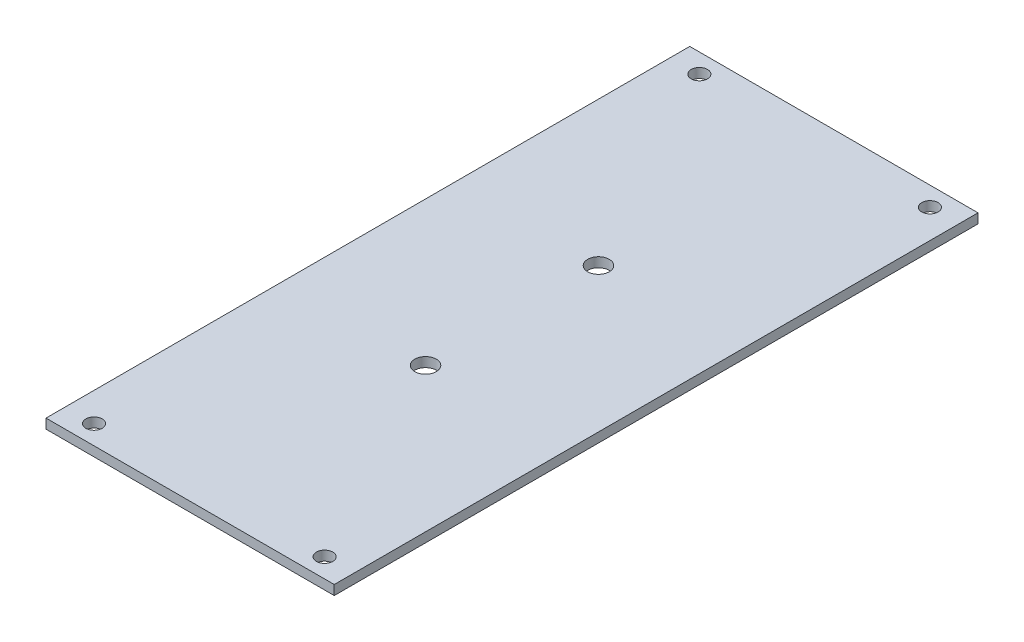
ISO-10303-21;
HEADER;
FILE_DESCRIPTION(('STEP AP214'),'2;1');
FILE_NAME('part.step','',(''),(''),'','','');
FILE_SCHEMA(('AUTOMOTIVE_DESIGN { 1 0 10303 214 1 1 1 1 }'));
ENDSEC;
DATA;
#1=APPLICATION_CONTEXT('core data for automotive mechanical design processes');
#2=APPLICATION_PROTOCOL_DEFINITION('international standard','automotive_design',2000,#1);
#3=PRODUCT_CONTEXT('',#1,'mechanical');
#4=PRODUCT('Part','Part','',(#3));
#5=PRODUCT_RELATED_PRODUCT_CATEGORY('part','',(#4));
#6=PRODUCT_DEFINITION_FORMATION('','',#4);
#7=PRODUCT_DEFINITION_CONTEXT('part definition',#1,'design');
#8=PRODUCT_DEFINITION('design','',#6,#7);
#9=PRODUCT_DEFINITION_SHAPE('','',#8);
#10=(LENGTH_UNIT() NAMED_UNIT(*) SI_UNIT(.MILLI.,.METRE.));
#11=(NAMED_UNIT(*) PLANE_ANGLE_UNIT() SI_UNIT($,.RADIAN.));
#12=(NAMED_UNIT(*) SI_UNIT($,.STERADIAN.) SOLID_ANGLE_UNIT());
#13=UNCERTAINTY_MEASURE_WITH_UNIT(LENGTH_MEASURE(1.E-05),#10,'distance_accuracy_value','');
#14=(GEOMETRIC_REPRESENTATION_CONTEXT(3) GLOBAL_UNCERTAINTY_ASSIGNED_CONTEXT((#13)) GLOBAL_UNIT_ASSIGNED_CONTEXT((#10,
#11,#12)) REPRESENTATION_CONTEXT('',''));
#15=CARTESIAN_POINT('',(0.,0.,0.));
#16=DIRECTION('',(0.,0.,1.));
#17=DIRECTION('',(1.,0.,0.));
#18=AXIS2_PLACEMENT_3D('',#15,#16,#17);
#19=CARTESIAN_POINT('',(30.,2.,-67.));
#20=DIRECTION('',(-1.,0.,0.));
#21=DIRECTION('',(0.,0.,1.));
#22=AXIS2_PLACEMENT_3D('',#19,#20,#21);
#23=PLANE('',#22);
#24=DIRECTION('',(0.,0.,-1.));
#25=VECTOR('',#24,1.);
#26=CARTESIAN_POINT('',(30.,0.,-67.));
#27=LINE('',#26,#25);
#28=CARTESIAN_POINT('',(30.,0.,67.));
#29=VERTEX_POINT('',#28);
#30=CARTESIAN_POINT('',(30.,0.,-67.));
#31=VERTEX_POINT('',#30);
#32=EDGE_CURVE('E103',#29,#31,#27,.T.);
#33=ORIENTED_EDGE('',*,*,#32,.T.);
#34=DIRECTION('',(0.,-1.,0.));
#35=VECTOR('',#34,1.);
#36=CARTESIAN_POINT('',(30.,2.,-67.));
#37=LINE('',#36,#35);
#38=CARTESIAN_POINT('',(30.,2.,-67.));
#39=VERTEX_POINT('',#38);
#40=EDGE_CURVE('E11',#39,#31,#37,.T.);
#41=ORIENTED_EDGE('',*,*,#40,.F.);
#42=DIRECTION('',(0.,0.,-1.));
#43=VECTOR('',#42,1.);
#44=CARTESIAN_POINT('',(30.,2.,-67.));
#45=LINE('',#44,#43);
#46=CARTESIAN_POINT('',(30.,2.,67.));
#47=VERTEX_POINT('',#46);
#48=EDGE_CURVE('E90',#47,#39,#45,.T.);
#49=ORIENTED_EDGE('',*,*,#48,.F.);
#50=DIRECTION('',(0.,-1.,0.));
#51=VECTOR('',#50,1.);
#52=CARTESIAN_POINT('',(30.,2.,67.));
#53=LINE('',#52,#51);
#54=EDGE_CURVE('E99',#47,#29,#53,.T.);
#55=ORIENTED_EDGE('',*,*,#54,.T.);
#56=EDGE_LOOP('',(#33,#41,#49,#55));
#57=FACE_BOUND('',#56,.T.);
#58=ADVANCED_FACE('F37',(#57),#23,.F.);
#59=CARTESIAN_POINT('',(-30.,2.,-67.));
#60=DIRECTION('',(0.,0.,1.));
#61=DIRECTION('',(1.,0.,0.));
#62=AXIS2_PLACEMENT_3D('',#59,#60,#61);
#63=PLANE('',#62);
#64=DIRECTION('',(-1.,0.,0.));
#65=VECTOR('',#64,1.);
#66=CARTESIAN_POINT('',(-30.,0.,-67.));
#67=LINE('',#66,#65);
#68=CARTESIAN_POINT('',(-30.,0.,-67.));
#69=VERTEX_POINT('',#68);
#70=EDGE_CURVE('E94',#31,#69,#67,.T.);
#71=ORIENTED_EDGE('',*,*,#70,.T.);
#72=DIRECTION('',(0.,-1.,0.));
#73=VECTOR('',#72,1.);
#74=CARTESIAN_POINT('',(-30.,2.,-67.));
#75=LINE('',#74,#73);
#76=CARTESIAN_POINT('',(-30.,2.,-67.));
#77=VERTEX_POINT('',#76);
#78=EDGE_CURVE('E46',#77,#69,#75,.T.);
#79=ORIENTED_EDGE('',*,*,#78,.F.);
#80=DIRECTION('',(-1.,0.,0.));
#81=VECTOR('',#80,1.);
#82=CARTESIAN_POINT('',(-30.,2.,-67.));
#83=LINE('',#82,#81);
#84=EDGE_CURVE('E85',#39,#77,#83,.T.);
#85=ORIENTED_EDGE('',*,*,#84,.F.);
#86=ORIENTED_EDGE('',*,*,#40,.T.);
#87=EDGE_LOOP('',(#71,#79,#85,#86));
#88=FACE_BOUND('',#87,.T.);
#89=ADVANCED_FACE('F93',(#88),#63,.F.);
#90=CARTESIAN_POINT('',(-30.,2.,-67.));
#91=DIRECTION('',(1.,0.,0.));
#92=DIRECTION('',(0.,0.,-1.));
#93=AXIS2_PLACEMENT_3D('',#90,#91,#92);
#94=PLANE('',#93);
#95=DIRECTION('',(0.,0.,1.));
#96=VECTOR('',#95,1.);
#97=CARTESIAN_POINT('',(-30.,0.,-67.));
#98=LINE('',#97,#96);
#99=CARTESIAN_POINT('',(-30.,0.,67.));
#100=VERTEX_POINT('',#99);
#101=EDGE_CURVE('E72',#69,#100,#98,.T.);
#102=ORIENTED_EDGE('',*,*,#101,.T.);
#103=DIRECTION('',(0.,-1.,0.));
#104=VECTOR('',#103,1.);
#105=CARTESIAN_POINT('',(-30.,2.,67.));
#106=LINE('',#105,#104);
#107=CARTESIAN_POINT('',(-30.,2.,67.));
#108=VERTEX_POINT('',#107);
#109=EDGE_CURVE('E95',#108,#100,#106,.T.);
#110=ORIENTED_EDGE('',*,*,#109,.F.);
#111=DIRECTION('',(0.,0.,1.));
#112=VECTOR('',#111,1.);
#113=CARTESIAN_POINT('',(-30.,2.,-67.));
#114=LINE('',#113,#112);
#115=EDGE_CURVE('E88',#77,#108,#114,.T.);
#116=ORIENTED_EDGE('',*,*,#115,.F.);
#117=ORIENTED_EDGE('',*,*,#78,.T.);
#118=EDGE_LOOP('',(#102,#110,#116,#117));
#119=FACE_BOUND('',#118,.T.);
#120=ADVANCED_FACE('F97',(#119),#94,.F.);
#121=CARTESIAN_POINT('',(-30.,2.,67.));
#122=DIRECTION('',(0.,0.,-1.));
#123=DIRECTION('',(-1.,0.,0.));
#124=AXIS2_PLACEMENT_3D('',#121,#122,#123);
#125=PLANE('',#124);
#126=DIRECTION('',(1.,0.,0.));
#127=VECTOR('',#126,1.);
#128=CARTESIAN_POINT('',(-30.,0.,67.));
#129=LINE('',#128,#127);
#130=EDGE_CURVE('E78',#100,#29,#129,.T.);
#131=ORIENTED_EDGE('',*,*,#130,.T.);
#132=ORIENTED_EDGE('',*,*,#54,.F.);
#133=DIRECTION('',(1.,0.,0.));
#134=VECTOR('',#133,1.);
#135=CARTESIAN_POINT('',(-30.,2.,67.));
#136=LINE('',#135,#134);
#137=EDGE_CURVE('E55',#108,#47,#136,.T.);
#138=ORIENTED_EDGE('',*,*,#137,.F.);
#139=ORIENTED_EDGE('',*,*,#109,.T.);
#140=EDGE_LOOP('',(#131,#132,#138,#139));
#141=FACE_BOUND('',#140,.T.);
#142=ADVANCED_FACE('F172',(#141),#125,.F.);
#143=CARTESIAN_POINT('',(0.,2.,0.));
#144=DIRECTION('',(0.,1.,0.));
#145=DIRECTION('',(0.,0.,1.));
#146=AXIS2_PLACEMENT_3D('',#143,#144,#145);
#147=PLANE('',#146);
#148=CARTESIAN_POINT('',(-24.,2.,-63.));
#149=DIRECTION('',(0.,1.,0.));
#150=DIRECTION('',(0.,0.,1.));
#151=AXIS2_PLACEMENT_3D('',#148,#149,#150);
#152=CIRCLE('',#151,1.7);
#153=CARTESIAN_POINT('',(-24.,2.,-61.3));
#154=VERTEX_POINT('',#153);
#155=EDGE_CURVE('E134',#154,#154,#152,.T.);
#156=ORIENTED_EDGE('',*,*,#155,.F.);
#157=EDGE_LOOP('',(#156));
#158=FACE_BOUND('',#157,.T.);
#159=CARTESIAN_POINT('',(24.,2.,-63.));
#160=DIRECTION('',(0.,1.,0.));
#161=DIRECTION('',(0.,0.,1.));
#162=AXIS2_PLACEMENT_3D('',#159,#160,#161);
#163=CIRCLE('',#162,1.7);
#164=CARTESIAN_POINT('',(24.,2.,-61.3));
#165=VERTEX_POINT('',#164);
#166=EDGE_CURVE('E123',#165,#165,#163,.T.);
#167=ORIENTED_EDGE('',*,*,#166,.F.);
#168=EDGE_LOOP('',(#167));
#169=FACE_BOUND('',#168,.T.);
#170=CARTESIAN_POINT('',(24.,2.,63.));
#171=DIRECTION('',(0.,1.,0.));
#172=DIRECTION('',(0.,0.,1.));
#173=AXIS2_PLACEMENT_3D('',#170,#171,#172);
#174=CIRCLE('',#173,1.7);
#175=CARTESIAN_POINT('',(24.,2.,64.7));
#176=VERTEX_POINT('',#175);
#177=EDGE_CURVE('E122',#176,#176,#174,.T.);
#178=ORIENTED_EDGE('',*,*,#177,.F.);
#179=EDGE_LOOP('',(#178));
#180=FACE_BOUND('',#179,.T.);
#181=CARTESIAN_POINT('',(-24.,2.,63.));
#182=DIRECTION('',(0.,1.,0.));
#183=DIRECTION('',(0.,0.,1.));
#184=AXIS2_PLACEMENT_3D('',#181,#182,#183);
#185=CIRCLE('',#184,1.7);
#186=CARTESIAN_POINT('',(-24.,2.,64.7));
#187=VERTEX_POINT('',#186);
#188=EDGE_CURVE('E119',#187,#187,#185,.T.);
#189=ORIENTED_EDGE('',*,*,#188,.F.);
#190=EDGE_LOOP('',(#189));
#191=FACE_BOUND('',#190,.T.);
#192=CARTESIAN_POINT('',(0.,2.,-18.));
#193=DIRECTION('',(0.,1.,0.));
#194=DIRECTION('',(0.,0.,1.));
#195=AXIS2_PLACEMENT_3D('',#192,#193,#194);
#196=CIRCLE('',#195,2.25);
#197=CARTESIAN_POINT('',(0.,2.,-15.75));
#198=VERTEX_POINT('',#197);
#199=EDGE_CURVE('E116',#198,#198,#196,.T.);
#200=ORIENTED_EDGE('',*,*,#199,.F.);
#201=EDGE_LOOP('',(#200));
#202=FACE_BOUND('',#201,.T.);
#203=CARTESIAN_POINT('',(0.,2.,18.));
#204=DIRECTION('',(0.,1.,0.));
#205=DIRECTION('',(0.,0.,1.));
#206=AXIS2_PLACEMENT_3D('',#203,#204,#205);
#207=CIRCLE('',#206,2.25);
#208=CARTESIAN_POINT('',(0.,2.,20.25));
#209=VERTEX_POINT('',#208);
#210=EDGE_CURVE('E115',#209,#209,#207,.T.);
#211=ORIENTED_EDGE('',*,*,#210,.F.);
#212=EDGE_LOOP('',(#211));
#213=FACE_BOUND('',#212,.T.);
#214=ORIENTED_EDGE('',*,*,#48,.T.);
#215=ORIENTED_EDGE('',*,*,#84,.T.);
#216=ORIENTED_EDGE('',*,*,#115,.T.);
#217=ORIENTED_EDGE('',*,*,#137,.T.);
#218=EDGE_LOOP('',(#214,#215,#216,#217));
#219=FACE_BOUND('',#218,.T.);
#220=ADVANCED_FACE('F86',(#158,#169,#180,#191,#202,#213,#219),#147,.T.);
#221=CARTESIAN_POINT('',(0.,0.,0.));
#222=DIRECTION('',(0.,1.,0.));
#223=DIRECTION('',(0.,0.,1.));
#224=AXIS2_PLACEMENT_3D('',#221,#222,#223);
#225=PLANE('',#224);
#226=CARTESIAN_POINT('',(-24.,0.,-63.));
#227=DIRECTION('',(0.,1.,0.));
#228=DIRECTION('',(0.,0.,1.));
#229=AXIS2_PLACEMENT_3D('',#226,#227,#228);
#230=CIRCLE('',#229,1.7);
#231=CARTESIAN_POINT('',(-24.,0.,-61.3));
#232=VERTEX_POINT('',#231);
#233=EDGE_CURVE('E40',#232,#232,#230,.T.);
#234=ORIENTED_EDGE('',*,*,#233,.T.);
#235=EDGE_LOOP('',(#234));
#236=FACE_BOUND('',#235,.T.);
#237=CARTESIAN_POINT('',(24.,0.,-63.));
#238=DIRECTION('',(0.,1.,0.));
#239=DIRECTION('',(0.,0.,1.));
#240=AXIS2_PLACEMENT_3D('',#237,#238,#239);
#241=CIRCLE('',#240,1.7);
#242=CARTESIAN_POINT('',(24.,0.,-61.3));
#243=VERTEX_POINT('',#242);
#244=EDGE_CURVE('E120',#243,#243,#241,.T.);
#245=ORIENTED_EDGE('',*,*,#244,.T.);
#246=EDGE_LOOP('',(#245));
#247=FACE_BOUND('',#246,.T.);
#248=CARTESIAN_POINT('',(24.,0.,63.));
#249=DIRECTION('',(0.,1.,0.));
#250=DIRECTION('',(0.,0.,1.));
#251=AXIS2_PLACEMENT_3D('',#248,#249,#250);
#252=CIRCLE('',#251,1.7);
#253=CARTESIAN_POINT('',(24.,0.,64.7));
#254=VERTEX_POINT('',#253);
#255=EDGE_CURVE('E127',#254,#254,#252,.T.);
#256=ORIENTED_EDGE('',*,*,#255,.T.);
#257=EDGE_LOOP('',(#256));
#258=FACE_BOUND('',#257,.T.);
#259=CARTESIAN_POINT('',(-24.,0.,63.));
#260=DIRECTION('',(0.,1.,0.));
#261=DIRECTION('',(0.,0.,1.));
#262=AXIS2_PLACEMENT_3D('',#259,#260,#261);
#263=CIRCLE('',#262,1.7);
#264=CARTESIAN_POINT('',(-24.,0.,64.7));
#265=VERTEX_POINT('',#264);
#266=EDGE_CURVE('E117',#265,#265,#263,.T.);
#267=ORIENTED_EDGE('',*,*,#266,.T.);
#268=EDGE_LOOP('',(#267));
#269=FACE_BOUND('',#268,.T.);
#270=CARTESIAN_POINT('',(0.,0.,-18.));
#271=DIRECTION('',(0.,1.,0.));
#272=DIRECTION('',(0.,0.,1.));
#273=AXIS2_PLACEMENT_3D('',#270,#271,#272);
#274=CIRCLE('',#273,2.25);
#275=CARTESIAN_POINT('',(0.,0.,-15.75));
#276=VERTEX_POINT('',#275);
#277=EDGE_CURVE('E112',#276,#276,#274,.T.);
#278=ORIENTED_EDGE('',*,*,#277,.T.);
#279=EDGE_LOOP('',(#278));
#280=FACE_BOUND('',#279,.T.);
#281=CARTESIAN_POINT('',(0.,0.,18.));
#282=DIRECTION('',(0.,1.,0.));
#283=DIRECTION('',(0.,0.,1.));
#284=AXIS2_PLACEMENT_3D('',#281,#282,#283);
#285=CIRCLE('',#284,2.25);
#286=CARTESIAN_POINT('',(0.,0.,20.25));
#287=VERTEX_POINT('',#286);
#288=EDGE_CURVE('E106',#287,#287,#285,.T.);
#289=ORIENTED_EDGE('',*,*,#288,.T.);
#290=EDGE_LOOP('',(#289));
#291=FACE_BOUND('',#290,.T.);
#292=ORIENTED_EDGE('',*,*,#32,.F.);
#293=ORIENTED_EDGE('',*,*,#130,.F.);
#294=ORIENTED_EDGE('',*,*,#101,.F.);
#295=ORIENTED_EDGE('',*,*,#70,.F.);
#296=EDGE_LOOP('',(#292,#293,#294,#295));
#297=FACE_BOUND('',#296,.T.);
#298=ADVANCED_FACE('F148',(#236,#247,#258,#269,#280,#291,#297),#225,.F.);
#299=CARTESIAN_POINT('',(0.,2.,18.));
#300=DIRECTION('',(0.,1.,0.));
#301=DIRECTION('',(0.,0.,1.));
#302=AXIS2_PLACEMENT_3D('',#299,#300,#301);
#303=CYLINDRICAL_SURFACE('',#302,2.25);
#304=ORIENTED_EDGE('',*,*,#210,.T.);
#305=EDGE_LOOP('',(#304));
#306=FACE_BOUND('',#305,.T.);
#307=ORIENTED_EDGE('',*,*,#288,.F.);
#308=EDGE_LOOP('',(#307));
#309=FACE_BOUND('',#308,.T.);
#310=ADVANCED_FACE('F151',(#306,#309),#303,.F.);
#311=CARTESIAN_POINT('',(0.,2.,-18.));
#312=DIRECTION('',(0.,1.,0.));
#313=DIRECTION('',(0.,0.,1.));
#314=AXIS2_PLACEMENT_3D('',#311,#312,#313);
#315=CYLINDRICAL_SURFACE('',#314,2.25);
#316=ORIENTED_EDGE('',*,*,#199,.T.);
#317=EDGE_LOOP('',(#316));
#318=FACE_BOUND('',#317,.T.);
#319=ORIENTED_EDGE('',*,*,#277,.F.);
#320=EDGE_LOOP('',(#319));
#321=FACE_BOUND('',#320,.T.);
#322=ADVANCED_FACE('F153',(#318,#321),#315,.F.);
#323=CARTESIAN_POINT('',(-24.,2.,63.));
#324=DIRECTION('',(0.,1.,0.));
#325=DIRECTION('',(0.,0.,1.));
#326=AXIS2_PLACEMENT_3D('',#323,#324,#325);
#327=CYLINDRICAL_SURFACE('',#326,1.7);
#328=ORIENTED_EDGE('',*,*,#188,.T.);
#329=EDGE_LOOP('',(#328));
#330=FACE_BOUND('',#329,.T.);
#331=ORIENTED_EDGE('',*,*,#266,.F.);
#332=EDGE_LOOP('',(#331));
#333=FACE_BOUND('',#332,.T.);
#334=ADVANCED_FACE('F160',(#330,#333),#327,.F.);
#335=CARTESIAN_POINT('',(24.,2.,63.));
#336=DIRECTION('',(0.,1.,0.));
#337=DIRECTION('',(0.,0.,1.));
#338=AXIS2_PLACEMENT_3D('',#335,#336,#337);
#339=CYLINDRICAL_SURFACE('',#338,1.7);
#340=ORIENTED_EDGE('',*,*,#177,.T.);
#341=EDGE_LOOP('',(#340));
#342=FACE_BOUND('',#341,.T.);
#343=ORIENTED_EDGE('',*,*,#255,.F.);
#344=EDGE_LOOP('',(#343));
#345=FACE_BOUND('',#344,.T.);
#346=ADVANCED_FACE('F236',(#342,#345),#339,.F.);
#347=CARTESIAN_POINT('',(24.,2.,-63.));
#348=DIRECTION('',(0.,1.,0.));
#349=DIRECTION('',(0.,0.,1.));
#350=AXIS2_PLACEMENT_3D('',#347,#348,#349);
#351=CYLINDRICAL_SURFACE('',#350,1.7);
#352=ORIENTED_EDGE('',*,*,#166,.T.);
#353=EDGE_LOOP('',(#352));
#354=FACE_BOUND('',#353,.T.);
#355=ORIENTED_EDGE('',*,*,#244,.F.);
#356=EDGE_LOOP('',(#355));
#357=FACE_BOUND('',#356,.T.);
#358=ADVANCED_FACE('F246',(#354,#357),#351,.F.);
#359=CARTESIAN_POINT('',(-24.,2.,-63.));
#360=DIRECTION('',(0.,1.,0.));
#361=DIRECTION('',(0.,0.,1.));
#362=AXIS2_PLACEMENT_3D('',#359,#360,#361);
#363=CYLINDRICAL_SURFACE('',#362,1.7);
#364=ORIENTED_EDGE('',*,*,#155,.T.);
#365=EDGE_LOOP('',(#364));
#366=FACE_BOUND('',#365,.T.);
#367=ORIENTED_EDGE('',*,*,#233,.F.);
#368=EDGE_LOOP('',(#367));
#369=FACE_BOUND('',#368,.T.);
#370=ADVANCED_FACE('F256',(#366,#369),#363,.F.);
#371=CLOSED_SHELL('',(#58,#89,#120,#142,#220,#298,#310,#322,#334,#346,#358,#370));
#372=MANIFOLD_SOLID_BREP('B2',#371);
#373=ADVANCED_BREP_SHAPE_REPRESENTATION('',(#18,#372),#14);
#374=SHAPE_DEFINITION_REPRESENTATION(#9,#373);
ENDSEC;
END-ISO-10303-21;
